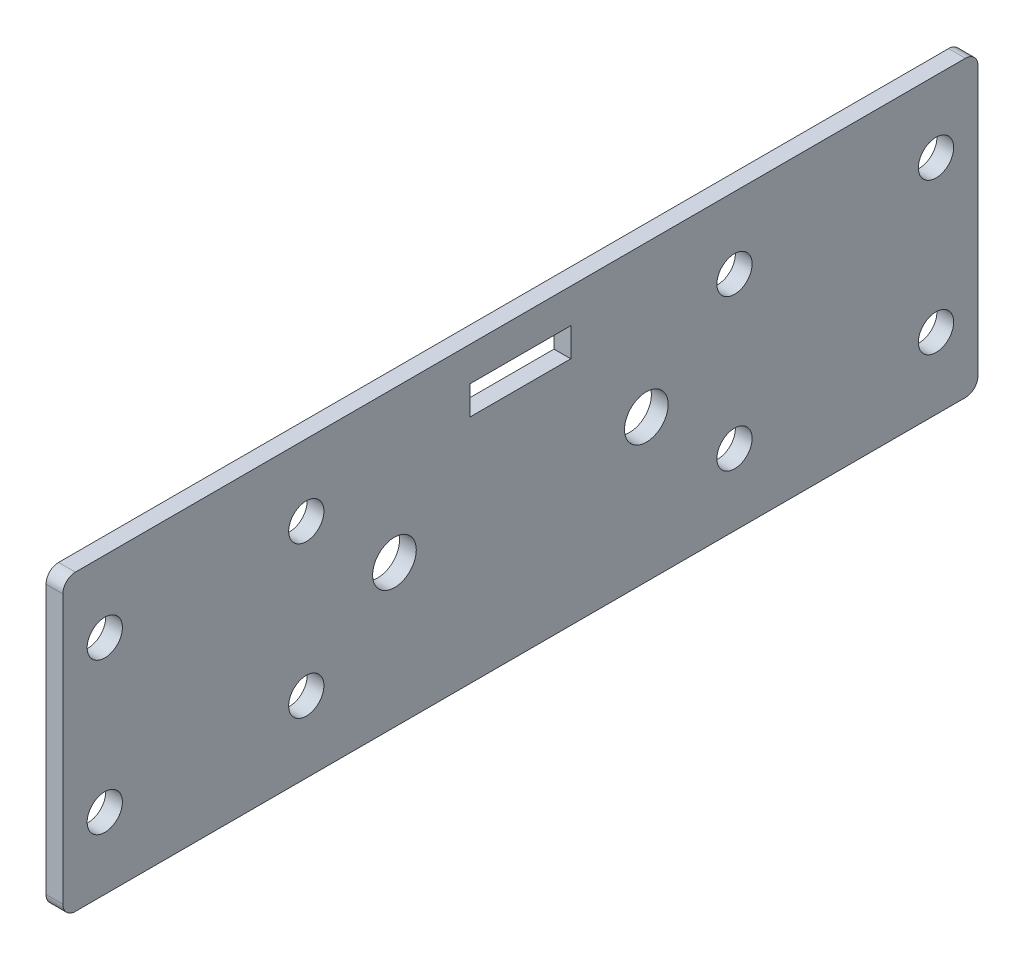
ISO-10303-21;
HEADER;
FILE_DESCRIPTION(('STEP AP214'),'2;1');
FILE_NAME('part.step','',(''),(''),'','','');
FILE_SCHEMA(('AUTOMOTIVE_DESIGN { 1 0 10303 214 1 1 1 1 }'));
ENDSEC;
DATA;
#1=APPLICATION_CONTEXT('core data for automotive mechanical design processes');
#2=APPLICATION_PROTOCOL_DEFINITION('international standard','automotive_design',2000,#1);
#3=PRODUCT_CONTEXT('',#1,'mechanical');
#4=PRODUCT('Part','Part','',(#3));
#5=PRODUCT_RELATED_PRODUCT_CATEGORY('part','',(#4));
#6=PRODUCT_DEFINITION_FORMATION('','',#4);
#7=PRODUCT_DEFINITION_CONTEXT('part definition',#1,'design');
#8=PRODUCT_DEFINITION('design','',#6,#7);
#9=PRODUCT_DEFINITION_SHAPE('','',#8);
#10=(LENGTH_UNIT() NAMED_UNIT(*) SI_UNIT(.MILLI.,.METRE.));
#11=(NAMED_UNIT(*) PLANE_ANGLE_UNIT() SI_UNIT($,.RADIAN.));
#12=(NAMED_UNIT(*) SI_UNIT($,.STERADIAN.) SOLID_ANGLE_UNIT());
#13=UNCERTAINTY_MEASURE_WITH_UNIT(LENGTH_MEASURE(1.E-05),#10,'distance_accuracy_value','');
#14=(GEOMETRIC_REPRESENTATION_CONTEXT(3) GLOBAL_UNCERTAINTY_ASSIGNED_CONTEXT((#13)) GLOBAL_UNIT_ASSIGNED_CONTEXT((#10,
#11,#12)) REPRESENTATION_CONTEXT('',''));
#15=CARTESIAN_POINT('',(0.,0.,0.));
#16=DIRECTION('',(0.,0.,1.));
#17=DIRECTION('',(1.,0.,0.));
#18=AXIS2_PLACEMENT_3D('',#15,#16,#17);
#19=CARTESIAN_POINT('',(2.,0.,0.));
#20=DIRECTION('',(1.,0.,0.));
#21=DIRECTION('',(0.,0.,-1.));
#22=AXIS2_PLACEMENT_3D('',#19,#20,#21);
#23=PLANE('',#22);
#24=CARTESIAN_POINT('',(2.,-18.,-39.5));
#25=DIRECTION('',(1.,0.,0.));
#26=DIRECTION('',(0.,0.,-1.));
#27=AXIS2_PLACEMENT_3D('',#24,#25,#26);
#28=CIRCLE('',#27,2.6);
#29=CARTESIAN_POINT('',(2.,-18.,-42.1));
#30=VERTEX_POINT('',#29);
#31=EDGE_CURVE('E157',#30,#30,#28,.T.);
#32=ORIENTED_EDGE('',*,*,#31,.F.);
#33=EDGE_LOOP('',(#32));
#34=FACE_BOUND('',#33,.T.);
#35=CARTESIAN_POINT('',(2.,-26.5,-29.));
#36=DIRECTION('',(1.,0.,0.));
#37=DIRECTION('',(0.,0.,1.));
#38=AXIS2_PLACEMENT_3D('',#35,#36,#37);
#39=CIRCLE('',#38,2.1);
#40=CARTESIAN_POINT('',(2.,-26.5,-26.9));
#41=VERTEX_POINT('',#40);
#42=EDGE_CURVE('E174',#41,#41,#39,.T.);
#43=ORIENTED_EDGE('',*,*,#42,.F.);
#44=EDGE_LOOP('',(#43));
#45=FACE_BOUND('',#44,.T.);
#46=CARTESIAN_POINT('',(2.,-26.5,-5.00000000000002));
#47=DIRECTION('',(1.,0.,0.));
#48=DIRECTION('',(0.,0.,-1.));
#49=AXIS2_PLACEMENT_3D('',#46,#47,#48);
#50=CIRCLE('',#49,2.1);
#51=CARTESIAN_POINT('',(2.,-26.5,-7.10000000000002));
#52=VERTEX_POINT('',#51);
#53=EDGE_CURVE('E186',#52,#52,#50,.T.);
#54=ORIENTED_EDGE('',*,*,#53,.F.);
#55=EDGE_LOOP('',(#54));
#56=FACE_BOUND('',#55,.T.);
#57=CARTESIAN_POINT('',(2.,-26.5,-80.));
#58=DIRECTION('',(1.,0.,0.));
#59=DIRECTION('',(0.,0.,-1.));
#60=AXIS2_PLACEMENT_3D('',#57,#58,#59);
#61=CIRCLE('',#60,2.1);
#62=CARTESIAN_POINT('',(2.,-26.5,-82.1));
#63=VERTEX_POINT('',#62);
#64=EDGE_CURVE('E198',#63,#63,#61,.T.);
#65=ORIENTED_EDGE('',*,*,#64,.F.);
#66=EDGE_LOOP('',(#65));
#67=FACE_BOUND('',#66,.T.);
#68=CARTESIAN_POINT('',(2.,-8.5,-104.));
#69=DIRECTION('',(1.,0.,0.));
#70=DIRECTION('',(0.,0.,-1.));
#71=AXIS2_PLACEMENT_3D('',#68,#69,#70);
#72=CIRCLE('',#71,2.1);
#73=CARTESIAN_POINT('',(2.,-8.5,-106.1));
#74=VERTEX_POINT('',#73);
#75=EDGE_CURVE('E210',#74,#74,#72,.T.);
#76=ORIENTED_EDGE('',*,*,#75,.F.);
#77=EDGE_LOOP('',(#76));
#78=FACE_BOUND('',#77,.T.);
#79=DIRECTION('',(0.,1.,0.));
#80=VECTOR('',#79,1.);
#81=CARTESIAN_POINT('',(2.,0.,-109.));
#82=LINE('',#81,#80);
#83=CARTESIAN_POINT('',(2.,-33.5,-109.));
#84=VERTEX_POINT('',#83);
#85=CARTESIAN_POINT('',(2.,-1.5,-109.));
#86=VERTEX_POINT('',#85);
#87=EDGE_CURVE('E221',#84,#86,#82,.T.);
#88=ORIENTED_EDGE('',*,*,#87,.T.);
#89=CARTESIAN_POINT('',(2.,-1.5,-107.5));
#90=DIRECTION('',(1.,0.,0.));
#91=DIRECTION('',(0.,0.,-1.));
#92=AXIS2_PLACEMENT_3D('',#89,#90,#91);
#93=CIRCLE('',#92,1.5);
#94=CARTESIAN_POINT('',(2.,0.,-107.5));
#95=VERTEX_POINT('',#94);
#96=EDGE_CURVE('E259',#86,#95,#93,.T.);
#97=ORIENTED_EDGE('',*,*,#96,.T.);
#98=DIRECTION('',(0.,0.,1.));
#99=VECTOR('',#98,1.);
#100=CARTESIAN_POINT('',(2.,0.,0.));
#101=LINE('',#100,#99);
#102=CARTESIAN_POINT('',(2.,0.,-1.5));
#103=VERTEX_POINT('',#102);
#104=EDGE_CURVE('E224',#95,#103,#101,.T.);
#105=ORIENTED_EDGE('',*,*,#104,.T.);
#106=CARTESIAN_POINT('',(2.,-1.5,-1.5));
#107=DIRECTION('',(1.,0.,0.));
#108=DIRECTION('',(0.,0.,-1.));
#109=AXIS2_PLACEMENT_3D('',#106,#107,#108);
#110=CIRCLE('',#109,1.5);
#111=CARTESIAN_POINT('',(2.,-1.5,0.));
#112=VERTEX_POINT('',#111);
#113=EDGE_CURVE('E254',#103,#112,#110,.T.);
#114=ORIENTED_EDGE('',*,*,#113,.T.);
#115=DIRECTION('',(0.,-1.,0.));
#116=VECTOR('',#115,1.);
#117=CARTESIAN_POINT('',(2.,0.,0.));
#118=LINE('',#117,#116);
#119=CARTESIAN_POINT('',(2.,-33.5,0.));
#120=VERTEX_POINT('',#119);
#121=EDGE_CURVE('E216',#112,#120,#118,.T.);
#122=ORIENTED_EDGE('',*,*,#121,.T.);
#123=CARTESIAN_POINT('',(2.,-33.5,-1.5));
#124=DIRECTION('',(1.,0.,0.));
#125=DIRECTION('',(0.,0.,-1.));
#126=AXIS2_PLACEMENT_3D('',#123,#124,#125);
#127=CIRCLE('',#126,1.5);
#128=CARTESIAN_POINT('',(2.,-35.,-1.5));
#129=VERTEX_POINT('',#128);
#130=EDGE_CURVE('E55',#120,#129,#127,.T.);
#131=ORIENTED_EDGE('',*,*,#130,.T.);
#132=DIRECTION('',(0.,0.,-1.));
#133=VECTOR('',#132,1.);
#134=CARTESIAN_POINT('',(2.,-35.,0.));
#135=LINE('',#134,#133);
#136=CARTESIAN_POINT('',(2.,-35.,-107.5));
#137=VERTEX_POINT('',#136);
#138=EDGE_CURVE('E218',#129,#137,#135,.T.);
#139=ORIENTED_EDGE('',*,*,#138,.T.);
#140=CARTESIAN_POINT('',(2.,-33.5,-107.5));
#141=DIRECTION('',(1.,0.,0.));
#142=DIRECTION('',(0.,0.,-1.));
#143=AXIS2_PLACEMENT_3D('',#140,#141,#142);
#144=CIRCLE('',#143,1.5);
#145=EDGE_CURVE('E257',#137,#84,#144,.T.);
#146=ORIENTED_EDGE('',*,*,#145,.T.);
#147=EDGE_LOOP('',(#88,#97,#105,#114,#122,#131,#139,#146));
#148=FACE_BOUND('',#147,.T.);
#149=CARTESIAN_POINT('',(2.,-26.5,-104.));
#150=DIRECTION('',(1.,0.,0.));
#151=DIRECTION('',(0.,0.,1.));
#152=AXIS2_PLACEMENT_3D('',#149,#150,#151);
#153=CIRCLE('',#152,2.1);
#154=CARTESIAN_POINT('',(2.,-26.5,-101.9));
#155=VERTEX_POINT('',#154);
#156=EDGE_CURVE('E204',#155,#155,#153,.T.);
#157=ORIENTED_EDGE('',*,*,#156,.F.);
#158=EDGE_LOOP('',(#157));
#159=FACE_BOUND('',#158,.T.);
#160=CARTESIAN_POINT('',(2.,-8.5,-80.));
#161=DIRECTION('',(1.,0.,0.));
#162=DIRECTION('',(0.,0.,1.));
#163=AXIS2_PLACEMENT_3D('',#160,#161,#162);
#164=CIRCLE('',#163,2.1);
#165=CARTESIAN_POINT('',(2.,-8.5,-77.9));
#166=VERTEX_POINT('',#165);
#167=EDGE_CURVE('E192',#166,#166,#164,.T.);
#168=ORIENTED_EDGE('',*,*,#167,.F.);
#169=EDGE_LOOP('',(#168));
#170=FACE_BOUND('',#169,.T.);
#171=CARTESIAN_POINT('',(2.,-8.50000000000002,-5.));
#172=DIRECTION('',(1.,0.,0.));
#173=DIRECTION('',(0.,0.,1.));
#174=AXIS2_PLACEMENT_3D('',#171,#172,#173);
#175=CIRCLE('',#174,2.1);
#176=CARTESIAN_POINT('',(2.,-8.50000000000002,-2.9));
#177=VERTEX_POINT('',#176);
#178=EDGE_CURVE('E180',#177,#177,#175,.T.);
#179=ORIENTED_EDGE('',*,*,#178,.F.);
#180=EDGE_LOOP('',(#179));
#181=FACE_BOUND('',#180,.T.);
#182=CARTESIAN_POINT('',(2.,-8.50000000000001,-29.));
#183=DIRECTION('',(1.,0.,0.));
#184=DIRECTION('',(0.,0.,-1.));
#185=AXIS2_PLACEMENT_3D('',#182,#183,#184);
#186=CIRCLE('',#185,2.1);
#187=CARTESIAN_POINT('',(2.,-8.50000000000001,-31.1));
#188=VERTEX_POINT('',#187);
#189=EDGE_CURVE('E168',#188,#188,#186,.T.);
#190=ORIENTED_EDGE('',*,*,#189,.F.);
#191=EDGE_LOOP('',(#190));
#192=FACE_BOUND('',#191,.T.);
#193=DIRECTION('',(0.,0.,1.));
#194=VECTOR('',#193,1.);
#195=CARTESIAN_POINT('',(2.,-4.08,-48.5));
#196=LINE('',#195,#194);
#197=CARTESIAN_POINT('',(2.,-4.08,-60.5));
#198=VERTEX_POINT('',#197);
#199=CARTESIAN_POINT('',(2.,-4.08,-48.5));
#200=VERTEX_POINT('',#199);
#201=EDGE_CURVE('E134',#198,#200,#196,.T.);
#202=ORIENTED_EDGE('',*,*,#201,.F.);
#203=DIRECTION('',(0.,1.,0.));
#204=VECTOR('',#203,1.);
#205=CARTESIAN_POINT('',(2.,-4.08,-60.5));
#206=LINE('',#205,#204);
#207=CARTESIAN_POINT('',(2.,-7.5,-60.5));
#208=VERTEX_POINT('',#207);
#209=EDGE_CURVE('E124',#208,#198,#206,.T.);
#210=ORIENTED_EDGE('',*,*,#209,.F.);
#211=DIRECTION('',(0.,0.,-1.));
#212=VECTOR('',#211,1.);
#213=CARTESIAN_POINT('',(2.,-7.5,-48.5));
#214=LINE('',#213,#212);
#215=CARTESIAN_POINT('',(2.,-7.5,-48.5));
#216=VERTEX_POINT('',#215);
#217=EDGE_CURVE('E150',#216,#208,#214,.T.);
#218=ORIENTED_EDGE('',*,*,#217,.F.);
#219=DIRECTION('',(0.,-1.,0.));
#220=VECTOR('',#219,1.);
#221=CARTESIAN_POINT('',(2.,-4.08,-48.5));
#222=LINE('',#221,#220);
#223=EDGE_CURVE('E148',#200,#216,#222,.T.);
#224=ORIENTED_EDGE('',*,*,#223,.F.);
#225=EDGE_LOOP('',(#202,#210,#218,#224));
#226=FACE_BOUND('',#225,.T.);
#227=CARTESIAN_POINT('',(2.,-18.,-69.5));
#228=DIRECTION('',(1.,0.,0.));
#229=DIRECTION('',(0.,0.,1.));
#230=AXIS2_PLACEMENT_3D('',#227,#228,#229);
#231=CIRCLE('',#230,2.6);
#232=CARTESIAN_POINT('',(2.,-18.,-66.9));
#233=VERTEX_POINT('',#232);
#234=EDGE_CURVE('E566',#233,#233,#231,.T.);
#235=ORIENTED_EDGE('',*,*,#234,.F.);
#236=EDGE_LOOP('',(#235));
#237=FACE_BOUND('',#236,.T.);
#238=ADVANCED_FACE('F33',(#34,#45,#56,#67,#78,#148,#159,#170,#181,#192,#226,#237),#23,.T.);
#239=CARTESIAN_POINT('',(0.,0.,0.));
#240=DIRECTION('',(1.,0.,0.));
#241=DIRECTION('',(0.,0.,-1.));
#242=AXIS2_PLACEMENT_3D('',#239,#240,#241);
#243=PLANE('',#242);
#244=CARTESIAN_POINT('',(0.,-8.50000000000001,-29.));
#245=DIRECTION('',(1.,0.,0.));
#246=DIRECTION('',(0.,0.,-1.));
#247=AXIS2_PLACEMENT_3D('',#244,#245,#246);
#248=CIRCLE('',#247,2.1);
#249=CARTESIAN_POINT('',(0.,-8.50000000000001,-31.1));
#250=VERTEX_POINT('',#249);
#251=EDGE_CURVE('E142',#250,#250,#248,.T.);
#252=ORIENTED_EDGE('',*,*,#251,.T.);
#253=EDGE_LOOP('',(#252));
#254=FACE_BOUND('',#253,.T.);
#255=CARTESIAN_POINT('',(0.,-26.5,-29.));
#256=DIRECTION('',(1.,0.,0.));
#257=DIRECTION('',(0.,0.,1.));
#258=AXIS2_PLACEMENT_3D('',#255,#256,#257);
#259=CIRCLE('',#258,2.1);
#260=CARTESIAN_POINT('',(0.,-26.5,-26.9));
#261=VERTEX_POINT('',#260);
#262=EDGE_CURVE('E171',#261,#261,#259,.T.);
#263=ORIENTED_EDGE('',*,*,#262,.T.);
#264=EDGE_LOOP('',(#263));
#265=FACE_BOUND('',#264,.T.);
#266=CARTESIAN_POINT('',(0.,-8.50000000000002,-5.));
#267=DIRECTION('',(1.,0.,0.));
#268=DIRECTION('',(0.,0.,1.));
#269=AXIS2_PLACEMENT_3D('',#266,#267,#268);
#270=CIRCLE('',#269,2.1);
#271=CARTESIAN_POINT('',(0.,-8.50000000000002,-2.9));
#272=VERTEX_POINT('',#271);
#273=EDGE_CURVE('E177',#272,#272,#270,.T.);
#274=ORIENTED_EDGE('',*,*,#273,.T.);
#275=EDGE_LOOP('',(#274));
#276=FACE_BOUND('',#275,.T.);
#277=CARTESIAN_POINT('',(0.,-26.5,-5.00000000000002));
#278=DIRECTION('',(1.,0.,0.));
#279=DIRECTION('',(0.,0.,-1.));
#280=AXIS2_PLACEMENT_3D('',#277,#278,#279);
#281=CIRCLE('',#280,2.1);
#282=CARTESIAN_POINT('',(0.,-26.5,-7.10000000000002));
#283=VERTEX_POINT('',#282);
#284=EDGE_CURVE('E183',#283,#283,#281,.T.);
#285=ORIENTED_EDGE('',*,*,#284,.T.);
#286=EDGE_LOOP('',(#285));
#287=FACE_BOUND('',#286,.T.);
#288=CARTESIAN_POINT('',(0.,-8.5,-80.));
#289=DIRECTION('',(1.,0.,0.));
#290=DIRECTION('',(0.,0.,1.));
#291=AXIS2_PLACEMENT_3D('',#288,#289,#290);
#292=CIRCLE('',#291,2.1);
#293=CARTESIAN_POINT('',(0.,-8.5,-77.9));
#294=VERTEX_POINT('',#293);
#295=EDGE_CURVE('E189',#294,#294,#292,.T.);
#296=ORIENTED_EDGE('',*,*,#295,.T.);
#297=EDGE_LOOP('',(#296));
#298=FACE_BOUND('',#297,.T.);
#299=CARTESIAN_POINT('',(0.,-26.5,-80.));
#300=DIRECTION('',(1.,0.,0.));
#301=DIRECTION('',(0.,0.,-1.));
#302=AXIS2_PLACEMENT_3D('',#299,#300,#301);
#303=CIRCLE('',#302,2.1);
#304=CARTESIAN_POINT('',(0.,-26.5,-82.1));
#305=VERTEX_POINT('',#304);
#306=EDGE_CURVE('E195',#305,#305,#303,.T.);
#307=ORIENTED_EDGE('',*,*,#306,.T.);
#308=EDGE_LOOP('',(#307));
#309=FACE_BOUND('',#308,.T.);
#310=CARTESIAN_POINT('',(0.,-26.5,-104.));
#311=DIRECTION('',(1.,0.,0.));
#312=DIRECTION('',(0.,0.,1.));
#313=AXIS2_PLACEMENT_3D('',#310,#311,#312);
#314=CIRCLE('',#313,2.1);
#315=CARTESIAN_POINT('',(0.,-26.5,-101.9));
#316=VERTEX_POINT('',#315);
#317=EDGE_CURVE('E201',#316,#316,#314,.T.);
#318=ORIENTED_EDGE('',*,*,#317,.T.);
#319=EDGE_LOOP('',(#318));
#320=FACE_BOUND('',#319,.T.);
#321=CARTESIAN_POINT('',(0.,-8.5,-104.));
#322=DIRECTION('',(1.,0.,0.));
#323=DIRECTION('',(0.,0.,-1.));
#324=AXIS2_PLACEMENT_3D('',#321,#322,#323);
#325=CIRCLE('',#324,2.1);
#326=CARTESIAN_POINT('',(0.,-8.5,-106.1));
#327=VERTEX_POINT('',#326);
#328=EDGE_CURVE('E207',#327,#327,#325,.T.);
#329=ORIENTED_EDGE('',*,*,#328,.T.);
#330=EDGE_LOOP('',(#329));
#331=FACE_BOUND('',#330,.T.);
#332=DIRECTION('',(0.,0.,1.));
#333=VECTOR('',#332,1.);
#334=CARTESIAN_POINT('',(0.,0.,0.));
#335=LINE('',#334,#333);
#336=CARTESIAN_POINT('',(0.,0.,-107.5));
#337=VERTEX_POINT('',#336);
#338=CARTESIAN_POINT('',(0.,0.,-1.5));
#339=VERTEX_POINT('',#338);
#340=EDGE_CURVE('E219',#337,#339,#335,.T.);
#341=ORIENTED_EDGE('',*,*,#340,.F.);
#342=CARTESIAN_POINT('',(0.,-1.5,-107.5));
#343=DIRECTION('',(1.,0.,0.));
#344=DIRECTION('',(0.,0.,-1.));
#345=AXIS2_PLACEMENT_3D('',#342,#343,#344);
#346=CIRCLE('',#345,1.5);
#347=CARTESIAN_POINT('',(0.,-1.5,-109.));
#348=VERTEX_POINT('',#347);
#349=EDGE_CURVE('E247',#337,#348,#346,.F.);
#350=ORIENTED_EDGE('',*,*,#349,.T.);
#351=DIRECTION('',(0.,1.,0.));
#352=VECTOR('',#351,1.);
#353=CARTESIAN_POINT('',(0.,0.,-109.));
#354=LINE('',#353,#352);
#355=CARTESIAN_POINT('',(0.,-33.5,-109.));
#356=VERTEX_POINT('',#355);
#357=EDGE_CURVE('E232',#356,#348,#354,.T.);
#358=ORIENTED_EDGE('',*,*,#357,.F.);
#359=CARTESIAN_POINT('',(0.,-33.5,-107.5));
#360=DIRECTION('',(1.,0.,0.));
#361=DIRECTION('',(0.,0.,-1.));
#362=AXIS2_PLACEMENT_3D('',#359,#360,#361);
#363=CIRCLE('',#362,1.5);
#364=CARTESIAN_POINT('',(0.,-35.,-107.5));
#365=VERTEX_POINT('',#364);
#366=EDGE_CURVE('E245',#356,#365,#363,.F.);
#367=ORIENTED_EDGE('',*,*,#366,.T.);
#368=DIRECTION('',(0.,0.,-1.));
#369=VECTOR('',#368,1.);
#370=CARTESIAN_POINT('',(0.,-35.,0.));
#371=LINE('',#370,#369);
#372=CARTESIAN_POINT('',(0.,-35.,-1.5));
#373=VERTEX_POINT('',#372);
#374=EDGE_CURVE('E230',#373,#365,#371,.T.);
#375=ORIENTED_EDGE('',*,*,#374,.F.);
#376=CARTESIAN_POINT('',(0.,-33.5,-1.5));
#377=DIRECTION('',(1.,0.,0.));
#378=DIRECTION('',(0.,0.,-1.));
#379=AXIS2_PLACEMENT_3D('',#376,#377,#378);
#380=CIRCLE('',#379,1.5);
#381=CARTESIAN_POINT('',(0.,-33.5,0.));
#382=VERTEX_POINT('',#381);
#383=EDGE_CURVE('E243',#373,#382,#380,.F.);
#384=ORIENTED_EDGE('',*,*,#383,.T.);
#385=DIRECTION('',(0.,-1.,0.));
#386=VECTOR('',#385,1.);
#387=CARTESIAN_POINT('',(0.,0.,0.));
#388=LINE('',#387,#386);
#389=CARTESIAN_POINT('',(0.,-1.5,0.));
#390=VERTEX_POINT('',#389);
#391=EDGE_CURVE('E213',#390,#382,#388,.T.);
#392=ORIENTED_EDGE('',*,*,#391,.F.);
#393=CARTESIAN_POINT('',(0.,-1.5,-1.5));
#394=DIRECTION('',(1.,0.,0.));
#395=DIRECTION('',(0.,0.,-1.));
#396=AXIS2_PLACEMENT_3D('',#393,#394,#395);
#397=CIRCLE('',#396,1.5);
#398=EDGE_CURVE('E241',#390,#339,#397,.F.);
#399=ORIENTED_EDGE('',*,*,#398,.T.);
#400=EDGE_LOOP('',(#341,#350,#358,#367,#375,#384,#392,#399));
#401=FACE_BOUND('',#400,.T.);
#402=DIRECTION('',(0.,1.,0.));
#403=VECTOR('',#402,1.);
#404=CARTESIAN_POINT('',(0.,-4.08,-60.5));
#405=LINE('',#404,#403);
#406=CARTESIAN_POINT('',(0.,-7.5,-60.5));
#407=VERTEX_POINT('',#406);
#408=CARTESIAN_POINT('',(0.,-4.08,-60.5));
#409=VERTEX_POINT('',#408);
#410=EDGE_CURVE('E155',#407,#409,#405,.T.);
#411=ORIENTED_EDGE('',*,*,#410,.T.);
#412=DIRECTION('',(0.,0.,1.));
#413=VECTOR('',#412,1.);
#414=CARTESIAN_POINT('',(0.,-4.08,-48.5));
#415=LINE('',#414,#413);
#416=CARTESIAN_POINT('',(0.,-4.08,-48.5));
#417=VERTEX_POINT('',#416);
#418=EDGE_CURVE('E141',#409,#417,#415,.T.);
#419=ORIENTED_EDGE('',*,*,#418,.T.);
#420=DIRECTION('',(0.,-1.,0.));
#421=VECTOR('',#420,1.);
#422=CARTESIAN_POINT('',(0.,-4.08,-48.5));
#423=LINE('',#422,#421);
#424=CARTESIAN_POINT('',(0.,-7.5,-48.5));
#425=VERTEX_POINT('',#424);
#426=EDGE_CURVE('E159',#417,#425,#423,.T.);
#427=ORIENTED_EDGE('',*,*,#426,.T.);
#428=DIRECTION('',(0.,0.,-1.));
#429=VECTOR('',#428,1.);
#430=CARTESIAN_POINT('',(0.,-7.5,-48.5));
#431=LINE('',#430,#429);
#432=EDGE_CURVE('E135',#425,#407,#431,.T.);
#433=ORIENTED_EDGE('',*,*,#432,.T.);
#434=EDGE_LOOP('',(#411,#419,#427,#433));
#435=FACE_BOUND('',#434,.T.);
#436=CARTESIAN_POINT('',(0.,-18.,-39.5));
#437=DIRECTION('',(1.,0.,0.));
#438=DIRECTION('',(0.,0.,-1.));
#439=AXIS2_PLACEMENT_3D('',#436,#437,#438);
#440=CIRCLE('',#439,2.6);
#441=CARTESIAN_POINT('',(0.,-18.,-42.1));
#442=VERTEX_POINT('',#441);
#443=EDGE_CURVE('E561',#442,#442,#440,.T.);
#444=ORIENTED_EDGE('',*,*,#443,.T.);
#445=EDGE_LOOP('',(#444));
#446=FACE_BOUND('',#445,.T.);
#447=CARTESIAN_POINT('',(0.,-18.,-69.5));
#448=DIRECTION('',(1.,0.,0.));
#449=DIRECTION('',(0.,0.,1.));
#450=AXIS2_PLACEMENT_3D('',#447,#448,#449);
#451=CIRCLE('',#450,2.6);
#452=CARTESIAN_POINT('',(0.,-18.,-66.9));
#453=VERTEX_POINT('',#452);
#454=EDGE_CURVE('E564',#453,#453,#451,.T.);
#455=ORIENTED_EDGE('',*,*,#454,.T.);
#456=EDGE_LOOP('',(#455));
#457=FACE_BOUND('',#456,.T.);
#458=ADVANCED_FACE('F275',(#254,#265,#276,#287,#298,#309,#320,#331,#401,#435,#446,#457),#243,.F.);
#459=CARTESIAN_POINT('',(2.,0.,0.));
#460=DIRECTION('',(0.,0.,-1.));
#461=DIRECTION('',(0.,1.,0.));
#462=AXIS2_PLACEMENT_3D('',#459,#460,#461);
#463=PLANE('',#462);
#464=ORIENTED_EDGE('',*,*,#391,.T.);
#465=DIRECTION('',(-1.,0.,0.));
#466=VECTOR('',#465,1.);
#467=CARTESIAN_POINT('',(2.,-33.5,0.));
#468=LINE('',#467,#466);
#469=EDGE_CURVE('E11',#382,#120,#468,.F.);
#470=ORIENTED_EDGE('',*,*,#469,.T.);
#471=ORIENTED_EDGE('',*,*,#121,.F.);
#472=DIRECTION('',(-1.,0.,0.));
#473=VECTOR('',#472,1.);
#474=CARTESIAN_POINT('',(2.,-1.5,0.));
#475=LINE('',#474,#473);
#476=EDGE_CURVE('E41',#112,#390,#475,.T.);
#477=ORIENTED_EDGE('',*,*,#476,.T.);
#478=EDGE_LOOP('',(#464,#470,#471,#477));
#479=FACE_BOUND('',#478,.T.);
#480=ADVANCED_FACE('F269',(#479),#463,.F.);
#481=CARTESIAN_POINT('',(2.,-35.,0.));
#482=DIRECTION('',(0.,1.,0.));
#483=DIRECTION('',(0.,0.,1.));
#484=AXIS2_PLACEMENT_3D('',#481,#482,#483);
#485=PLANE('',#484);
#486=ORIENTED_EDGE('',*,*,#374,.T.);
#487=DIRECTION('',(-1.,0.,0.));
#488=VECTOR('',#487,1.);
#489=CARTESIAN_POINT('',(2.,-35.,-107.5));
#490=LINE('',#489,#488);
#491=EDGE_CURVE('E48',#365,#137,#490,.F.);
#492=ORIENTED_EDGE('',*,*,#491,.T.);
#493=ORIENTED_EDGE('',*,*,#138,.F.);
#494=DIRECTION('',(-1.,0.,0.));
#495=VECTOR('',#494,1.);
#496=CARTESIAN_POINT('',(2.,-35.,-1.5));
#497=LINE('',#496,#495);
#498=EDGE_CURVE('E261',#129,#373,#497,.T.);
#499=ORIENTED_EDGE('',*,*,#498,.T.);
#500=EDGE_LOOP('',(#486,#492,#493,#499));
#501=FACE_BOUND('',#500,.T.);
#502=ADVANCED_FACE('F281',(#501),#485,.F.);
#503=CARTESIAN_POINT('',(2.,0.,-109.));
#504=DIRECTION('',(0.,0.,1.));
#505=DIRECTION('',(1.,0.,0.));
#506=AXIS2_PLACEMENT_3D('',#503,#504,#505);
#507=PLANE('',#506);
#508=ORIENTED_EDGE('',*,*,#357,.T.);
#509=DIRECTION('',(-1.,0.,0.));
#510=VECTOR('',#509,1.);
#511=CARTESIAN_POINT('',(2.,-1.5,-109.));
#512=LINE('',#511,#510);
#513=EDGE_CURVE('E252',#348,#86,#512,.F.);
#514=ORIENTED_EDGE('',*,*,#513,.T.);
#515=ORIENTED_EDGE('',*,*,#87,.F.);
#516=DIRECTION('',(-1.,0.,0.));
#517=VECTOR('',#516,1.);
#518=CARTESIAN_POINT('',(2.,-33.5,-109.));
#519=LINE('',#518,#517);
#520=EDGE_CURVE('E249',#84,#356,#519,.T.);
#521=ORIENTED_EDGE('',*,*,#520,.T.);
#522=EDGE_LOOP('',(#508,#514,#515,#521));
#523=FACE_BOUND('',#522,.T.);
#524=ADVANCED_FACE('F290',(#523),#507,.F.);
#525=CARTESIAN_POINT('',(2.,0.,0.));
#526=DIRECTION('',(0.,-1.,0.));
#527=DIRECTION('',(0.,0.,-1.));
#528=AXIS2_PLACEMENT_3D('',#525,#526,#527);
#529=PLANE('',#528);
#530=ORIENTED_EDGE('',*,*,#104,.F.);
#531=DIRECTION('',(-1.,0.,0.));
#532=VECTOR('',#531,1.);
#533=CARTESIAN_POINT('',(2.,0.,-107.5));
#534=LINE('',#533,#532);
#535=EDGE_CURVE('E238',#95,#337,#534,.T.);
#536=ORIENTED_EDGE('',*,*,#535,.T.);
#537=ORIENTED_EDGE('',*,*,#340,.T.);
#538=DIRECTION('',(-1.,0.,0.));
#539=VECTOR('',#538,1.);
#540=CARTESIAN_POINT('',(2.,0.,-1.5));
#541=LINE('',#540,#539);
#542=EDGE_CURVE('E227',#339,#103,#541,.F.);
#543=ORIENTED_EDGE('',*,*,#542,.T.);
#544=EDGE_LOOP('',(#530,#536,#537,#543));
#545=FACE_BOUND('',#544,.T.);
#546=ADVANCED_FACE('F298',(#545),#529,.F.);
#547=CARTESIAN_POINT('',(2.,-8.5,-104.));
#548=DIRECTION('',(-1.,0.,0.));
#549=DIRECTION('',(0.,0.,1.));
#550=AXIS2_PLACEMENT_3D('',#547,#548,#549);
#551=CYLINDRICAL_SURFACE('',#550,2.1);
#552=ORIENTED_EDGE('',*,*,#75,.T.);
#553=EDGE_LOOP('',(#552));
#554=FACE_BOUND('',#553,.T.);
#555=ORIENTED_EDGE('',*,*,#328,.F.);
#556=EDGE_LOOP('',(#555));
#557=FACE_BOUND('',#556,.T.);
#558=ADVANCED_FACE('F316',(#554,#557),#551,.F.);
#559=CARTESIAN_POINT('',(2.,-26.5,-104.));
#560=DIRECTION('',(-1.,0.,0.));
#561=DIRECTION('',(0.,0.,1.));
#562=AXIS2_PLACEMENT_3D('',#559,#560,#561);
#563=CYLINDRICAL_SURFACE('',#562,2.1);
#564=ORIENTED_EDGE('',*,*,#156,.T.);
#565=EDGE_LOOP('',(#564));
#566=FACE_BOUND('',#565,.T.);
#567=ORIENTED_EDGE('',*,*,#317,.F.);
#568=EDGE_LOOP('',(#567));
#569=FACE_BOUND('',#568,.T.);
#570=ADVANCED_FACE('F453',(#566,#569),#563,.F.);
#571=CARTESIAN_POINT('',(2.,-26.5,-80.));
#572=DIRECTION('',(-1.,0.,0.));
#573=DIRECTION('',(0.,0.,1.));
#574=AXIS2_PLACEMENT_3D('',#571,#572,#573);
#575=CYLINDRICAL_SURFACE('',#574,2.1);
#576=ORIENTED_EDGE('',*,*,#64,.T.);
#577=EDGE_LOOP('',(#576));
#578=FACE_BOUND('',#577,.T.);
#579=ORIENTED_EDGE('',*,*,#306,.F.);
#580=EDGE_LOOP('',(#579));
#581=FACE_BOUND('',#580,.T.);
#582=ADVANCED_FACE('F444',(#578,#581),#575,.F.);
#583=CARTESIAN_POINT('',(2.,-8.5,-80.));
#584=DIRECTION('',(-1.,0.,0.));
#585=DIRECTION('',(0.,0.,1.));
#586=AXIS2_PLACEMENT_3D('',#583,#584,#585);
#587=CYLINDRICAL_SURFACE('',#586,2.1);
#588=ORIENTED_EDGE('',*,*,#167,.T.);
#589=EDGE_LOOP('',(#588));
#590=FACE_BOUND('',#589,.T.);
#591=ORIENTED_EDGE('',*,*,#295,.F.);
#592=EDGE_LOOP('',(#591));
#593=FACE_BOUND('',#592,.T.);
#594=ADVANCED_FACE('F435',(#590,#593),#587,.F.);
#595=CARTESIAN_POINT('',(2.,-26.5,-5.00000000000002));
#596=DIRECTION('',(-1.,0.,0.));
#597=DIRECTION('',(0.,0.,1.));
#598=AXIS2_PLACEMENT_3D('',#595,#596,#597);
#599=CYLINDRICAL_SURFACE('',#598,2.1);
#600=ORIENTED_EDGE('',*,*,#53,.T.);
#601=EDGE_LOOP('',(#600));
#602=FACE_BOUND('',#601,.T.);
#603=ORIENTED_EDGE('',*,*,#284,.F.);
#604=EDGE_LOOP('',(#603));
#605=FACE_BOUND('',#604,.T.);
#606=ADVANCED_FACE('F426',(#602,#605),#599,.F.);
#607=CARTESIAN_POINT('',(2.,-8.50000000000002,-5.));
#608=DIRECTION('',(-1.,0.,0.));
#609=DIRECTION('',(0.,0.,1.));
#610=AXIS2_PLACEMENT_3D('',#607,#608,#609);
#611=CYLINDRICAL_SURFACE('',#610,2.1);
#612=ORIENTED_EDGE('',*,*,#178,.T.);
#613=EDGE_LOOP('',(#612));
#614=FACE_BOUND('',#613,.T.);
#615=ORIENTED_EDGE('',*,*,#273,.F.);
#616=EDGE_LOOP('',(#615));
#617=FACE_BOUND('',#616,.T.);
#618=ADVANCED_FACE('F417',(#614,#617),#611,.F.);
#619=CARTESIAN_POINT('',(2.,-26.5,-29.));
#620=DIRECTION('',(-1.,0.,0.));
#621=DIRECTION('',(0.,0.,1.));
#622=AXIS2_PLACEMENT_3D('',#619,#620,#621);
#623=CYLINDRICAL_SURFACE('',#622,2.1);
#624=ORIENTED_EDGE('',*,*,#42,.T.);
#625=EDGE_LOOP('',(#624));
#626=FACE_BOUND('',#625,.T.);
#627=ORIENTED_EDGE('',*,*,#262,.F.);
#628=EDGE_LOOP('',(#627));
#629=FACE_BOUND('',#628,.T.);
#630=ADVANCED_FACE('F408',(#626,#629),#623,.F.);
#631=CARTESIAN_POINT('',(2.,-8.50000000000001,-29.));
#632=DIRECTION('',(-1.,0.,0.));
#633=DIRECTION('',(0.,0.,1.));
#634=AXIS2_PLACEMENT_3D('',#631,#632,#633);
#635=CYLINDRICAL_SURFACE('',#634,2.1);
#636=ORIENTED_EDGE('',*,*,#189,.T.);
#637=EDGE_LOOP('',(#636));
#638=FACE_BOUND('',#637,.T.);
#639=ORIENTED_EDGE('',*,*,#251,.F.);
#640=EDGE_LOOP('',(#639));
#641=FACE_BOUND('',#640,.T.);
#642=ADVANCED_FACE('F400',(#638,#641),#635,.F.);
#643=CARTESIAN_POINT('',(2.,-4.08,-60.5));
#644=DIRECTION('',(0.,0.,1.));
#645=DIRECTION('',(1.,0.,0.));
#646=AXIS2_PLACEMENT_3D('',#643,#644,#645);
#647=PLANE('',#646);
#648=ORIENTED_EDGE('',*,*,#410,.F.);
#649=DIRECTION('',(-1.,0.,0.));
#650=VECTOR('',#649,1.);
#651=CARTESIAN_POINT('',(2.,-7.5,-60.5));
#652=LINE('',#651,#650);
#653=EDGE_CURVE('E130',#208,#407,#652,.T.);
#654=ORIENTED_EDGE('',*,*,#653,.F.);
#655=ORIENTED_EDGE('',*,*,#209,.T.);
#656=DIRECTION('',(-1.,0.,0.));
#657=VECTOR('',#656,1.);
#658=CARTESIAN_POINT('',(2.,-4.08,-60.5));
#659=LINE('',#658,#657);
#660=EDGE_CURVE('E127',#198,#409,#659,.T.);
#661=ORIENTED_EDGE('',*,*,#660,.T.);
#662=EDGE_LOOP('',(#648,#654,#655,#661));
#663=FACE_BOUND('',#662,.T.);
#664=ADVANCED_FACE('F126',(#663),#647,.T.);
#665=CARTESIAN_POINT('',(2.,-4.08,-48.5));
#666=DIRECTION('',(0.,-1.,0.));
#667=DIRECTION('',(0.,0.,-1.));
#668=AXIS2_PLACEMENT_3D('',#665,#666,#667);
#669=PLANE('',#668);
#670=ORIENTED_EDGE('',*,*,#418,.F.);
#671=ORIENTED_EDGE('',*,*,#660,.F.);
#672=ORIENTED_EDGE('',*,*,#201,.T.);
#673=DIRECTION('',(-1.,0.,0.));
#674=VECTOR('',#673,1.);
#675=CARTESIAN_POINT('',(2.,-4.08,-48.5));
#676=LINE('',#675,#674);
#677=EDGE_CURVE('E143',#200,#417,#676,.T.);
#678=ORIENTED_EDGE('',*,*,#677,.T.);
#679=EDGE_LOOP('',(#670,#671,#672,#678));
#680=FACE_BOUND('',#679,.T.);
#681=ADVANCED_FACE('F138',(#680),#669,.T.);
#682=CARTESIAN_POINT('',(2.,-4.08,-48.5));
#683=DIRECTION('',(0.,0.,-1.));
#684=DIRECTION('',(-1.,0.,0.));
#685=AXIS2_PLACEMENT_3D('',#682,#683,#684);
#686=PLANE('',#685);
#687=ORIENTED_EDGE('',*,*,#426,.F.);
#688=ORIENTED_EDGE('',*,*,#677,.F.);
#689=ORIENTED_EDGE('',*,*,#223,.T.);
#690=DIRECTION('',(-1.,0.,0.));
#691=VECTOR('',#690,1.);
#692=CARTESIAN_POINT('',(2.,-7.5,-48.5));
#693=LINE('',#692,#691);
#694=EDGE_CURVE('E165',#216,#425,#693,.T.);
#695=ORIENTED_EDGE('',*,*,#694,.T.);
#696=EDGE_LOOP('',(#687,#688,#689,#695));
#697=FACE_BOUND('',#696,.T.);
#698=ADVANCED_FACE('F376',(#697),#686,.T.);
#699=CARTESIAN_POINT('',(2.,-7.5,-48.5));
#700=DIRECTION('',(0.,1.,0.));
#701=DIRECTION('',(0.,0.,1.));
#702=AXIS2_PLACEMENT_3D('',#699,#700,#701);
#703=PLANE('',#702);
#704=ORIENTED_EDGE('',*,*,#432,.F.);
#705=ORIENTED_EDGE('',*,*,#694,.F.);
#706=ORIENTED_EDGE('',*,*,#217,.T.);
#707=ORIENTED_EDGE('',*,*,#653,.T.);
#708=EDGE_LOOP('',(#704,#705,#706,#707));
#709=FACE_BOUND('',#708,.T.);
#710=ADVANCED_FACE('F367',(#709),#703,.T.);
#711=CARTESIAN_POINT('',(2.,-18.,-39.5));
#712=DIRECTION('',(-1.,0.,0.));
#713=DIRECTION('',(0.,0.,1.));
#714=AXIS2_PLACEMENT_3D('',#711,#712,#713);
#715=CYLINDRICAL_SURFACE('',#714,2.6);
#716=ORIENTED_EDGE('',*,*,#31,.T.);
#717=EDGE_LOOP('',(#716));
#718=FACE_BOUND('',#717,.T.);
#719=ORIENTED_EDGE('',*,*,#443,.F.);
#720=EDGE_LOOP('',(#719));
#721=FACE_BOUND('',#720,.T.);
#722=ADVANCED_FACE('F358',(#718,#721),#715,.F.);
#723=CARTESIAN_POINT('',(2.,-18.,-69.5));
#724=DIRECTION('',(-1.,0.,0.));
#725=DIRECTION('',(0.,0.,1.));
#726=AXIS2_PLACEMENT_3D('',#723,#724,#725);
#727=CYLINDRICAL_SURFACE('',#726,2.6);
#728=ORIENTED_EDGE('',*,*,#234,.T.);
#729=EDGE_LOOP('',(#728));
#730=FACE_BOUND('',#729,.T.);
#731=ORIENTED_EDGE('',*,*,#454,.F.);
#732=EDGE_LOOP('',(#731));
#733=FACE_BOUND('',#732,.T.);
#734=ADVANCED_FACE('F329',(#730,#733),#727,.F.);
#735=CARTESIAN_POINT('',(2.,-1.5,-107.5));
#736=DIRECTION('',(-1.,0.,0.));
#737=DIRECTION('',(0.,0.,1.));
#738=AXIS2_PLACEMENT_3D('',#735,#736,#737);
#739=CYLINDRICAL_SURFACE('',#738,1.5);
#740=ORIENTED_EDGE('',*,*,#96,.F.);
#741=ORIENTED_EDGE('',*,*,#513,.F.);
#742=ORIENTED_EDGE('',*,*,#349,.F.);
#743=ORIENTED_EDGE('',*,*,#535,.F.);
#744=EDGE_LOOP('',(#740,#741,#742,#743));
#745=FACE_BOUND('',#744,.T.);
#746=ADVANCED_FACE('F295',(#745),#739,.T.);
#747=CARTESIAN_POINT('',(2.,-33.5,-107.5));
#748=DIRECTION('',(-1.,0.,0.));
#749=DIRECTION('',(0.,0.,1.));
#750=AXIS2_PLACEMENT_3D('',#747,#748,#749);
#751=CYLINDRICAL_SURFACE('',#750,1.5);
#752=ORIENTED_EDGE('',*,*,#145,.F.);
#753=ORIENTED_EDGE('',*,*,#491,.F.);
#754=ORIENTED_EDGE('',*,*,#366,.F.);
#755=ORIENTED_EDGE('',*,*,#520,.F.);
#756=EDGE_LOOP('',(#752,#753,#754,#755));
#757=FACE_BOUND('',#756,.T.);
#758=ADVANCED_FACE('F287',(#757),#751,.T.);
#759=CARTESIAN_POINT('',(2.,-33.5,-1.5));
#760=DIRECTION('',(-1.,0.,0.));
#761=DIRECTION('',(0.,0.,1.));
#762=AXIS2_PLACEMENT_3D('',#759,#760,#761);
#763=CYLINDRICAL_SURFACE('',#762,1.5);
#764=ORIENTED_EDGE('',*,*,#130,.F.);
#765=ORIENTED_EDGE('',*,*,#469,.F.);
#766=ORIENTED_EDGE('',*,*,#383,.F.);
#767=ORIENTED_EDGE('',*,*,#498,.F.);
#768=EDGE_LOOP('',(#764,#765,#766,#767));
#769=FACE_BOUND('',#768,.T.);
#770=ADVANCED_FACE('F280',(#769),#763,.T.);
#771=CARTESIAN_POINT('',(2.,-1.5,-1.5));
#772=DIRECTION('',(-1.,0.,0.));
#773=DIRECTION('',(0.,0.,1.));
#774=AXIS2_PLACEMENT_3D('',#771,#772,#773);
#775=CYLINDRICAL_SURFACE('',#774,1.5);
#776=ORIENTED_EDGE('',*,*,#113,.F.);
#777=ORIENTED_EDGE('',*,*,#542,.F.);
#778=ORIENTED_EDGE('',*,*,#398,.F.);
#779=ORIENTED_EDGE('',*,*,#476,.F.);
#780=EDGE_LOOP('',(#776,#777,#778,#779));
#781=FACE_BOUND('',#780,.T.);
#782=ADVANCED_FACE('F35',(#781),#775,.T.);
#783=CLOSED_SHELL('',(#238,#458,#480,#502,#524,#546,#558,#570,#582,#594,#606,#618,#630,#642,
#664,#681,#698,#710,#722,#734,#746,#758,#770,#782));
#784=MANIFOLD_SOLID_BREP('B2',#783);
#785=ADVANCED_BREP_SHAPE_REPRESENTATION('',(#18,#784),#14);
#786=SHAPE_DEFINITION_REPRESENTATION(#9,#785);
ENDSEC;
END-ISO-10303-21;
